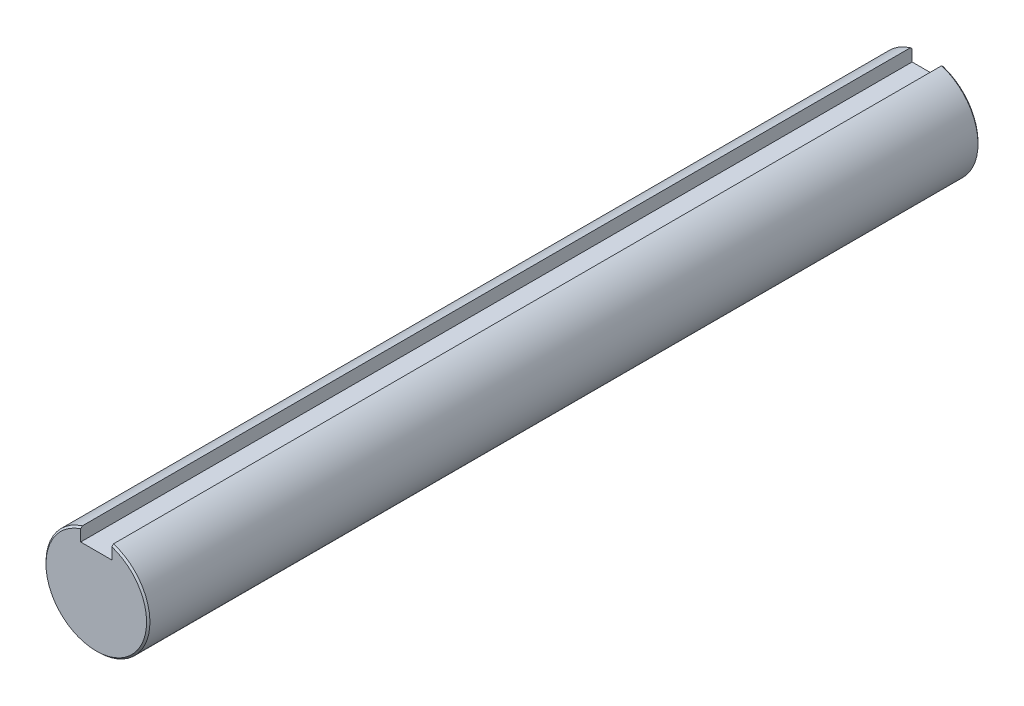
ISO-10303-21;
HEADER;
FILE_DESCRIPTION(('STEP AP214'),'2;1');
FILE_NAME('part.step','',(''),(''),'','','');
FILE_SCHEMA(('AUTOMOTIVE_DESIGN { 1 0 10303 214 1 1 1 1 }'));
ENDSEC;
DATA;
#1=APPLICATION_CONTEXT('core data for automotive mechanical design processes');
#2=APPLICATION_PROTOCOL_DEFINITION('international standard','automotive_design',2000,#1);
#3=PRODUCT_CONTEXT('',#1,'mechanical');
#4=PRODUCT('Part','Part','',(#3));
#5=PRODUCT_RELATED_PRODUCT_CATEGORY('part','',(#4));
#6=PRODUCT_DEFINITION_FORMATION('','',#4);
#7=PRODUCT_DEFINITION_CONTEXT('part definition',#1,'design');
#8=PRODUCT_DEFINITION('design','',#6,#7);
#9=PRODUCT_DEFINITION_SHAPE('','',#8);
#10=(LENGTH_UNIT() NAMED_UNIT(*) SI_UNIT(.MILLI.,.METRE.));
#11=(NAMED_UNIT(*) PLANE_ANGLE_UNIT() SI_UNIT($,.RADIAN.));
#12=(NAMED_UNIT(*) SI_UNIT($,.STERADIAN.) SOLID_ANGLE_UNIT());
#13=UNCERTAINTY_MEASURE_WITH_UNIT(LENGTH_MEASURE(1.E-05),#10,'distance_accuracy_value','');
#14=(GEOMETRIC_REPRESENTATION_CONTEXT(3) GLOBAL_UNCERTAINTY_ASSIGNED_CONTEXT((#13)) GLOBAL_UNIT_ASSIGNED_CONTEXT((#10,
#11,#12)) REPRESENTATION_CONTEXT('',''));
#15=CARTESIAN_POINT('',(0.,0.,0.));
#16=DIRECTION('',(0.,0.,1.));
#17=DIRECTION('',(1.,0.,0.));
#18=AXIS2_PLACEMENT_3D('',#15,#16,#17);
#19=CARTESIAN_POINT('',(-2.38125,0.,127.));
#20=DIRECTION('',(-1.,0.,0.));
#21=DIRECTION('',(0.,0.,1.));
#22=AXIS2_PLACEMENT_3D('',#19,#20,#21);
#23=PLANE('',#22);
#24=DIRECTION('',(0.,1.,0.));
#25=VECTOR('',#24,1.);
#26=CARTESIAN_POINT('',(-2.38125,0.,0.));
#27=LINE('',#26,#25);
#28=CARTESIAN_POINT('',(-2.38125,5.55625,0.));
#29=VERTEX_POINT('',#28);
#30=CARTESIAN_POINT('',(-2.38125,7.30519135187436,0.));
#31=VERTEX_POINT('',#30);
#32=EDGE_CURVE('E115',#29,#31,#27,.T.);
#33=ORIENTED_EDGE('',*,*,#32,.T.);
#34=CARTESIAN_POINT('',(-2.38125,7.30519135187436,0.));
#35=CARTESIAN_POINT('',(-2.38125,7.34967676740784,0.0422963325171251));
#36=CARTESIAN_POINT('',(-2.38125,7.39414456351819,0.0846111655020281));
#37=CARTESIAN_POINT('',(-2.38125,7.48304491664221,0.169277832168905));
#38=CARTESIAN_POINT('',(-2.38125,7.52747747365607,0.21162966585067));
#39=CARTESIAN_POINT('',(-2.38125,7.57189241124701,0.254000000000005));
#40=B_SPLINE_CURVE_WITH_KNOTS('',3,(#34,#35,#36,#37,#38,#39),.UNSPECIFIED.,.F.,.F.,(4,2,4),(0.,
0.184150400035041,0.36830079903267),.UNSPECIFIED.);
#41=CARTESIAN_POINT('',(-2.38125,7.57189241124701,0.254000000000004));
#42=VERTEX_POINT('',#41);
#43=EDGE_CURVE('E41',#31,#42,#40,.T.);
#44=ORIENTED_EDGE('',*,*,#43,.T.);
#45=DIRECTION('',(0.,0.,-1.));
#46=VECTOR('',#45,1.);
#47=CARTESIAN_POINT('',(-2.38125,7.57189241124701,127.));
#48=LINE('',#47,#46);
#49=CARTESIAN_POINT('',(-2.38125,7.57189241124701,126.746));
#50=VERTEX_POINT('',#49);
#51=EDGE_CURVE('E121',#50,#42,#48,.T.);
#52=ORIENTED_EDGE('',*,*,#51,.F.);
#53=CARTESIAN_POINT('',(-2.38125,7.57189241124701,126.746));
#54=CARTESIAN_POINT('',(-2.38125,7.52747747365607,126.788370334149));
#55=CARTESIAN_POINT('',(-2.38125,7.4830449166422,126.830722167831));
#56=CARTESIAN_POINT('',(-2.38125,7.39414456351819,126.915388834498));
#57=CARTESIAN_POINT('',(-2.38125,7.34967676740784,126.957703667483));
#58=CARTESIAN_POINT('',(-2.38125,7.30519135187436,127.));
#59=B_SPLINE_CURVE_WITH_KNOTS('',3,(#53,#54,#55,#56,#57,#58),.UNSPECIFIED.,.F.,.F.,(4,2,4),(0.,
0.184150398997639,0.368300799032669),.UNSPECIFIED.);
#60=CARTESIAN_POINT('',(-2.38125,7.30519135187436,127.));
#61=VERTEX_POINT('',#60);
#62=EDGE_CURVE('E48',#50,#61,#59,.T.);
#63=ORIENTED_EDGE('',*,*,#62,.T.);
#64=DIRECTION('',(0.,1.,0.));
#65=VECTOR('',#64,1.);
#66=CARTESIAN_POINT('',(-2.38125,0.,127.));
#67=LINE('',#66,#65);
#68=CARTESIAN_POINT('',(-2.38125,5.55625,127.));
#69=VERTEX_POINT('',#68);
#70=EDGE_CURVE('E108',#69,#61,#67,.T.);
#71=ORIENTED_EDGE('',*,*,#70,.F.);
#72=DIRECTION('',(0.,0.,-1.));
#73=VECTOR('',#72,1.);
#74=CARTESIAN_POINT('',(-2.38125,5.55625,127.));
#75=LINE('',#74,#73);
#76=EDGE_CURVE('E101',#69,#29,#75,.T.);
#77=ORIENTED_EDGE('',*,*,#76,.T.);
#78=EDGE_LOOP('',(#33,#44,#52,#63,#71,#77));
#79=FACE_BOUND('',#78,.T.);
#80=ADVANCED_FACE('F32',(#79),#23,.F.);
#81=CARTESIAN_POINT('',(0.,0.,127.));
#82=DIRECTION('',(0.,0.,-1.));
#83=DIRECTION('',(-1.,0.,0.));
#84=AXIS2_PLACEMENT_3D('',#81,#82,#83);
#85=CYLINDRICAL_SURFACE('',#84,7.9375);
#86=ORIENTED_EDGE('',*,*,#51,.T.);
#87=CARTESIAN_POINT('',(0.,0.,0.254000000000004));
#88=DIRECTION('',(0.,0.,1.));
#89=DIRECTION('',(1.,0.,0.));
#90=AXIS2_PLACEMENT_3D('',#87,#88,#89);
#91=CIRCLE('',#90,7.9375);
#92=CARTESIAN_POINT('',(2.38125,7.57189241124701,0.254000000000004));
#93=VERTEX_POINT('',#92);
#94=EDGE_CURVE('E126',#42,#93,#91,.T.);
#95=ORIENTED_EDGE('',*,*,#94,.T.);
#96=DIRECTION('',(0.,0.,-1.));
#97=VECTOR('',#96,1.);
#98=CARTESIAN_POINT('',(2.38125,7.57189241124701,127.));
#99=LINE('',#98,#97);
#100=CARTESIAN_POINT('',(2.38125,7.57189241124701,126.746));
#101=VERTEX_POINT('',#100);
#102=EDGE_CURVE('E100',#101,#93,#99,.T.);
#103=ORIENTED_EDGE('',*,*,#102,.F.);
#104=CARTESIAN_POINT('',(0.,0.,126.746));
#105=DIRECTION('',(0.,0.,1.));
#106=DIRECTION('',(1.,0.,0.));
#107=AXIS2_PLACEMENT_3D('',#104,#105,#106);
#108=CIRCLE('',#107,7.9375);
#109=EDGE_CURVE('E124',#101,#50,#108,.F.);
#110=ORIENTED_EDGE('',*,*,#109,.T.);
#111=EDGE_LOOP('',(#86,#95,#103,#110));
#112=FACE_BOUND('',#111,.T.);
#113=ADVANCED_FACE('F144',(#112),#85,.T.);
#114=CARTESIAN_POINT('',(2.38125,0.,127.));
#115=DIRECTION('',(-1.,0.,0.));
#116=DIRECTION('',(0.,0.,1.));
#117=AXIS2_PLACEMENT_3D('',#114,#115,#116);
#118=PLANE('',#117);
#119=ORIENTED_EDGE('',*,*,#102,.T.);
#120=CARTESIAN_POINT('',(2.38125,7.57189241124701,0.254000000000004));
#121=CARTESIAN_POINT('',(2.38125,7.52747747365608,0.21162966585067));
#122=CARTESIAN_POINT('',(2.38125,7.48304491664221,0.169277832168905));
#123=CARTESIAN_POINT('',(2.38125,7.39414456351819,0.0846111655020282));
#124=CARTESIAN_POINT('',(2.38125,7.34967676740784,0.042296332517125));
#125=CARTESIAN_POINT('',(2.38125,7.30519135187436,0.));
#126=B_SPLINE_CURVE_WITH_KNOTS('',3,(#120,#121,#122,#123,#124,#125),.UNSPECIFIED.,.F.,.F.,(4,2,
4),(0.,0.184150398997629,0.368300799032671),.UNSPECIFIED.);
#127=CARTESIAN_POINT('',(2.38125,7.30519135187436,0.));
#128=VERTEX_POINT('',#127);
#129=EDGE_CURVE('E135',#93,#128,#126,.T.);
#130=ORIENTED_EDGE('',*,*,#129,.T.);
#131=DIRECTION('',(0.,1.,0.));
#132=VECTOR('',#131,1.);
#133=CARTESIAN_POINT('',(2.38125,0.,0.));
#134=LINE('',#133,#132);
#135=CARTESIAN_POINT('',(2.38125,5.55625,0.));
#136=VERTEX_POINT('',#135);
#137=EDGE_CURVE('E95',#136,#128,#134,.T.);
#138=ORIENTED_EDGE('',*,*,#137,.F.);
#139=DIRECTION('',(0.,0.,-1.));
#140=VECTOR('',#139,1.);
#141=CARTESIAN_POINT('',(2.38125,5.55625,127.));
#142=LINE('',#141,#140);
#143=CARTESIAN_POINT('',(2.38125,5.55625,127.));
#144=VERTEX_POINT('',#143);
#145=EDGE_CURVE('E90',#144,#136,#142,.T.);
#146=ORIENTED_EDGE('',*,*,#145,.F.);
#147=DIRECTION('',(0.,1.,0.));
#148=VECTOR('',#147,1.);
#149=CARTESIAN_POINT('',(2.38125,0.,127.));
#150=LINE('',#149,#148);
#151=CARTESIAN_POINT('',(2.38125,7.30519135187436,127.));
#152=VERTEX_POINT('',#151);
#153=EDGE_CURVE('E94',#144,#152,#150,.T.);
#154=ORIENTED_EDGE('',*,*,#153,.T.);
#155=CARTESIAN_POINT('',(2.38125,7.30519135187436,127.));
#156=CARTESIAN_POINT('',(2.38125,7.34967676740784,126.957703667483));
#157=CARTESIAN_POINT('',(2.38125,7.39414456351819,126.915388834498));
#158=CARTESIAN_POINT('',(2.38125,7.4830449166422,126.830722167831));
#159=CARTESIAN_POINT('',(2.38125,7.52747747365607,126.788370334149));
#160=CARTESIAN_POINT('',(2.38125,7.57189241124701,126.746));
#161=B_SPLINE_CURVE_WITH_KNOTS('',3,(#155,#156,#157,#158,#159,#160),.UNSPECIFIED.,.F.,.F.,(4,2,
4),(0.,0.184150400035031,0.368300799032671),.UNSPECIFIED.);
#162=EDGE_CURVE('E129',#152,#101,#161,.T.);
#163=ORIENTED_EDGE('',*,*,#162,.T.);
#164=EDGE_LOOP('',(#119,#130,#138,#146,#154,#163));
#165=FACE_BOUND('',#164,.T.);
#166=ADVANCED_FACE('F93',(#165),#118,.T.);
#167=CARTESIAN_POINT('',(0.,5.55625,127.));
#168=DIRECTION('',(0.,1.,0.));
#169=DIRECTION('',(0.,0.,1.));
#170=AXIS2_PLACEMENT_3D('',#167,#168,#169);
#171=PLANE('',#170);
#172=DIRECTION('',(1.,0.,0.));
#173=VECTOR('',#172,1.);
#174=CARTESIAN_POINT('',(0.,5.55625,0.));
#175=LINE('',#174,#173);
#176=EDGE_CURVE('E118',#29,#136,#175,.T.);
#177=ORIENTED_EDGE('',*,*,#176,.F.);
#178=ORIENTED_EDGE('',*,*,#76,.F.);
#179=DIRECTION('',(1.,0.,0.));
#180=VECTOR('',#179,1.);
#181=CARTESIAN_POINT('',(0.,5.55625,127.));
#182=LINE('',#181,#180);
#183=EDGE_CURVE('E106',#69,#144,#182,.T.);
#184=ORIENTED_EDGE('',*,*,#183,.T.);
#185=ORIENTED_EDGE('',*,*,#145,.T.);
#186=EDGE_LOOP('',(#177,#178,#184,#185));
#187=FACE_BOUND('',#186,.T.);
#188=ADVANCED_FACE('F110',(#187),#171,.T.);
#189=CARTESIAN_POINT('',(0.,0.,127.));
#190=DIRECTION('',(0.,0.,1.));
#191=DIRECTION('',(1.,0.,0.));
#192=AXIS2_PLACEMENT_3D('',#189,#190,#191);
#193=PLANE('',#192);
#194=ORIENTED_EDGE('',*,*,#70,.T.);
#195=CARTESIAN_POINT('',(0.,0.,127.));
#196=DIRECTION('',(0.,0.,1.));
#197=DIRECTION('',(1.,0.,0.));
#198=AXIS2_PLACEMENT_3D('',#195,#196,#197);
#199=CIRCLE('',#198,7.6835);
#200=EDGE_CURVE('E11',#61,#152,#199,.T.);
#201=ORIENTED_EDGE('',*,*,#200,.T.);
#202=ORIENTED_EDGE('',*,*,#153,.F.);
#203=ORIENTED_EDGE('',*,*,#183,.F.);
#204=EDGE_LOOP('',(#194,#201,#202,#203));
#205=FACE_BOUND('',#204,.T.);
#206=ADVANCED_FACE('F105',(#205),#193,.T.);
#207=CARTESIAN_POINT('',(0.,0.,0.));
#208=DIRECTION('',(0.,0.,1.));
#209=DIRECTION('',(1.,0.,0.));
#210=AXIS2_PLACEMENT_3D('',#207,#208,#209);
#211=PLANE('',#210);
#212=ORIENTED_EDGE('',*,*,#137,.T.);
#213=CARTESIAN_POINT('',(0.,0.,0.));
#214=DIRECTION('',(0.,0.,1.));
#215=DIRECTION('',(1.,0.,0.));
#216=AXIS2_PLACEMENT_3D('',#213,#214,#215);
#217=CIRCLE('',#216,7.6835);
#218=EDGE_CURVE('E56',#128,#31,#217,.F.);
#219=ORIENTED_EDGE('',*,*,#218,.T.);
#220=ORIENTED_EDGE('',*,*,#32,.F.);
#221=ORIENTED_EDGE('',*,*,#176,.T.);
#222=EDGE_LOOP('',(#212,#219,#220,#221));
#223=FACE_BOUND('',#222,.T.);
#224=ADVANCED_FACE('F166',(#223),#211,.F.);
#225=CARTESIAN_POINT('',(0.,0.,0.254000000000004));
#226=DIRECTION('',(0.,0.,1.));
#227=DIRECTION('',(1.,0.,0.));
#228=AXIS2_PLACEMENT_3D('',#225,#226,#227);
#229=CONICAL_SURFACE('',#228,7.9375,0.785398163397448);
#230=ORIENTED_EDGE('',*,*,#43,.F.);
#231=ORIENTED_EDGE('',*,*,#218,.F.);
#232=ORIENTED_EDGE('',*,*,#129,.F.);
#233=ORIENTED_EDGE('',*,*,#94,.F.);
#234=EDGE_LOOP('',(#230,#231,#232,#233));
#235=FACE_BOUND('',#234,.T.);
#236=ADVANCED_FACE('F152',(#235),#229,.T.);
#237=CARTESIAN_POINT('',(0.,0.,127.));
#238=DIRECTION('',(0.,0.,-1.));
#239=DIRECTION('',(-1.,0.,0.));
#240=AXIS2_PLACEMENT_3D('',#237,#238,#239);
#241=CONICAL_SURFACE('',#240,7.6835,0.785398163397448);
#242=ORIENTED_EDGE('',*,*,#62,.F.);
#243=ORIENTED_EDGE('',*,*,#109,.F.);
#244=ORIENTED_EDGE('',*,*,#162,.F.);
#245=ORIENTED_EDGE('',*,*,#200,.F.);
#246=EDGE_LOOP('',(#242,#243,#244,#245));
#247=FACE_BOUND('',#246,.T.);
#248=ADVANCED_FACE('F34',(#247),#241,.T.);
#249=CLOSED_SHELL('',(#80,#113,#166,#188,#206,#224,#236,#248));
#250=MANIFOLD_SOLID_BREP('B2',#249);
#251=ADVANCED_BREP_SHAPE_REPRESENTATION('',(#18,#250),#14);
#252=SHAPE_DEFINITION_REPRESENTATION(#9,#251);
ENDSEC;
END-ISO-10303-21;
